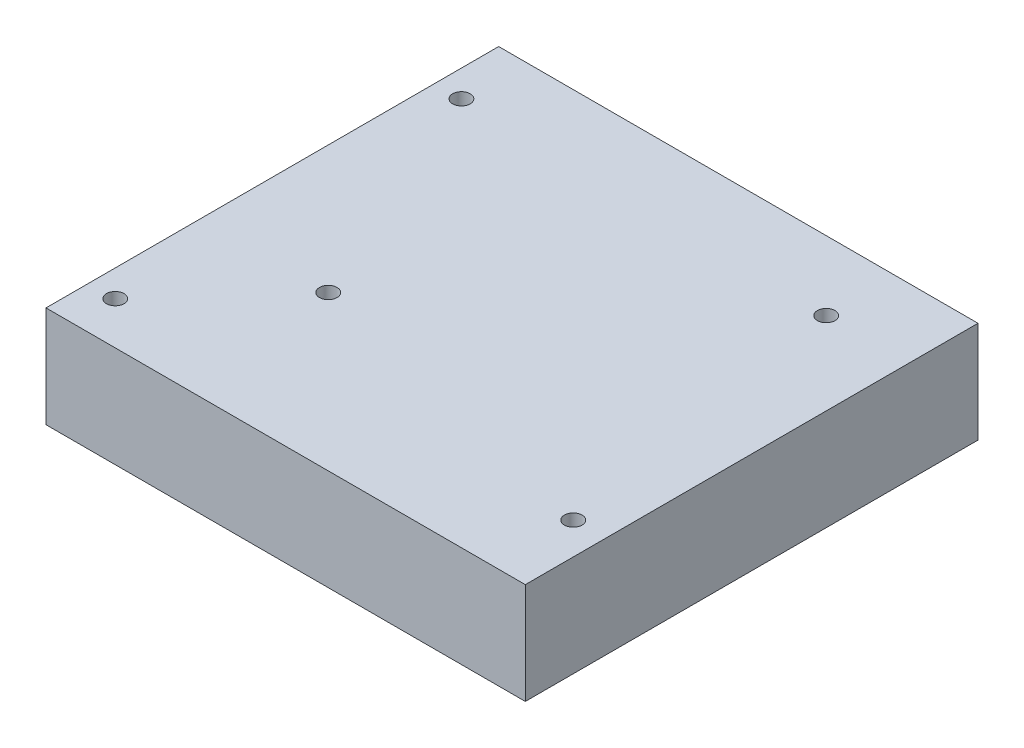
ISO-10303-21;
HEADER;
FILE_DESCRIPTION(('STEP AP214'),'2;1');
FILE_NAME('part.step','',(''),(''),'','','');
FILE_SCHEMA(('AUTOMOTIVE_DESIGN { 1 0 10303 214 1 1 1 1 }'));
ENDSEC;
DATA;
#1=APPLICATION_CONTEXT('core data for automotive mechanical design processes');
#2=APPLICATION_PROTOCOL_DEFINITION('international standard','automotive_design',2000,#1);
#3=PRODUCT_CONTEXT('',#1,'mechanical');
#4=PRODUCT('Part','Part','',(#3));
#5=PRODUCT_RELATED_PRODUCT_CATEGORY('part','',(#4));
#6=PRODUCT_DEFINITION_FORMATION('','',#4);
#7=PRODUCT_DEFINITION_CONTEXT('part definition',#1,'design');
#8=PRODUCT_DEFINITION('design','',#6,#7);
#9=PRODUCT_DEFINITION_SHAPE('','',#8);
#10=(LENGTH_UNIT() NAMED_UNIT(*) SI_UNIT(.MILLI.,.METRE.));
#11=(NAMED_UNIT(*) PLANE_ANGLE_UNIT() SI_UNIT($,.RADIAN.));
#12=(NAMED_UNIT(*) SI_UNIT($,.STERADIAN.) SOLID_ANGLE_UNIT());
#13=UNCERTAINTY_MEASURE_WITH_UNIT(LENGTH_MEASURE(1.E-05),#10,'distance_accuracy_value','');
#14=(GEOMETRIC_REPRESENTATION_CONTEXT(3) GLOBAL_UNCERTAINTY_ASSIGNED_CONTEXT((#13)) GLOBAL_UNIT_ASSIGNED_CONTEXT((#10,
#11,#12)) REPRESENTATION_CONTEXT('',''));
#15=CARTESIAN_POINT('',(0.,0.,0.));
#16=DIRECTION('',(0.,0.,1.));
#17=DIRECTION('',(1.,0.,0.));
#18=AXIS2_PLACEMENT_3D('',#15,#16,#17);
#19=CARTESIAN_POINT('',(0.,19.,0.));
#20=DIRECTION('',(0.,-1.,0.));
#21=DIRECTION('',(0.,0.,-1.));
#22=AXIS2_PLACEMENT_3D('',#19,#20,#21);
#23=PLANE('',#22);
#24=CARTESIAN_POINT('',(24.,19.,-29.));
#25=DIRECTION('',(0.,1.,0.));
#26=DIRECTION('',(0.,0.,1.));
#27=AXIS2_PLACEMENT_3D('',#24,#25,#26);
#28=CIRCLE('',#27,1.65);
#29=CARTESIAN_POINT('',(24.,19.,-27.35));
#30=VERTEX_POINT('',#29);
#31=EDGE_CURVE('E128',#30,#30,#28,.T.);
#32=ORIENTED_EDGE('',*,*,#31,.F.);
#33=EDGE_LOOP('',(#32));
#34=FACE_BOUND('',#33,.T.);
#35=CARTESIAN_POINT('',(5.,19.,-8.));
#36=DIRECTION('',(0.,1.,0.));
#37=DIRECTION('',(0.,0.,1.));
#38=AXIS2_PLACEMENT_3D('',#35,#36,#37);
#39=CIRCLE('',#38,1.65);
#40=CARTESIAN_POINT('',(5.,19.,-6.35));
#41=VERTEX_POINT('',#40);
#42=EDGE_CURVE('E116',#41,#41,#39,.T.);
#43=ORIENTED_EDGE('',*,*,#42,.F.);
#44=EDGE_LOOP('',(#43));
#45=FACE_BOUND('',#44,.T.);
#46=DIRECTION('',(0.,0.,1.));
#47=VECTOR('',#46,1.);
#48=CARTESIAN_POINT('',(0.,19.,0.));
#49=LINE('',#48,#47);
#50=CARTESIAN_POINT('',(0.,19.,-85.));
#51=VERTEX_POINT('',#50);
#52=CARTESIAN_POINT('',(0.,19.,0.));
#53=VERTEX_POINT('',#52);
#54=EDGE_CURVE('E86',#51,#53,#49,.T.);
#55=ORIENTED_EDGE('',*,*,#54,.T.);
#56=DIRECTION('',(1.,0.,0.));
#57=VECTOR('',#56,1.);
#58=CARTESIAN_POINT('',(0.,19.,0.));
#59=LINE('',#58,#57);
#60=CARTESIAN_POINT('',(90.,19.,0.));
#61=VERTEX_POINT('',#60);
#62=EDGE_CURVE('E81',#53,#61,#59,.T.);
#63=ORIENTED_EDGE('',*,*,#62,.T.);
#64=DIRECTION('',(0.,0.,-1.));
#65=VECTOR('',#64,1.);
#66=CARTESIAN_POINT('',(90.,19.,0.));
#67=LINE('',#66,#65);
#68=CARTESIAN_POINT('',(90.,19.,-85.));
#69=VERTEX_POINT('',#68);
#70=EDGE_CURVE('E84',#61,#69,#67,.T.);
#71=ORIENTED_EDGE('',*,*,#70,.T.);
#72=DIRECTION('',(-1.,0.,0.));
#73=VECTOR('',#72,1.);
#74=CARTESIAN_POINT('',(0.,19.,-85.));
#75=LINE('',#74,#73);
#76=EDGE_CURVE('E51',#69,#51,#75,.T.);
#77=ORIENTED_EDGE('',*,*,#76,.T.);
#78=EDGE_LOOP('',(#55,#63,#71,#77));
#79=FACE_BOUND('',#78,.T.);
#80=CARTESIAN_POINT('',(5.,19.,-73.));
#81=DIRECTION('',(0.,1.,0.));
#82=DIRECTION('',(0.,0.,1.));
#83=AXIS2_PLACEMENT_3D('',#80,#81,#82);
#84=CIRCLE('',#83,1.65);
#85=CARTESIAN_POINT('',(5.,19.,-71.35));
#86=VERTEX_POINT('',#85);
#87=EDGE_CURVE('E101',#86,#86,#84,.T.);
#88=ORIENTED_EDGE('',*,*,#87,.F.);
#89=EDGE_LOOP('',(#88));
#90=FACE_BOUND('',#89,.T.);
#91=CARTESIAN_POINT('',(84.,19.,-15.));
#92=DIRECTION('',(0.,1.,0.));
#93=DIRECTION('',(0.,0.,1.));
#94=AXIS2_PLACEMENT_3D('',#91,#92,#93);
#95=CIRCLE('',#94,1.65);
#96=CARTESIAN_POINT('',(84.,19.,-13.35));
#97=VERTEX_POINT('',#96);
#98=EDGE_CURVE('E122',#97,#97,#95,.T.);
#99=ORIENTED_EDGE('',*,*,#98,.F.);
#100=EDGE_LOOP('',(#99));
#101=FACE_BOUND('',#100,.T.);
#102=CARTESIAN_POINT('',(74.5,19.,-72.));
#103=DIRECTION('',(0.,1.,0.));
#104=DIRECTION('',(0.,0.,1.));
#105=AXIS2_PLACEMENT_3D('',#102,#103,#104);
#106=CIRCLE('',#105,1.65);
#107=CARTESIAN_POINT('',(74.5,19.,-70.35));
#108=VERTEX_POINT('',#107);
#109=EDGE_CURVE('E134',#108,#108,#106,.T.);
#110=ORIENTED_EDGE('',*,*,#109,.F.);
#111=EDGE_LOOP('',(#110));
#112=FACE_BOUND('',#111,.T.);
#113=ADVANCED_FACE('F34',(#34,#45,#79,#90,#101,#112),#23,.F.);
#114=CARTESIAN_POINT('',(0.,0.,0.));
#115=DIRECTION('',(0.,-1.,0.));
#116=DIRECTION('',(0.,0.,-1.));
#117=AXIS2_PLACEMENT_3D('',#114,#115,#116);
#118=PLANE('',#117);
#119=CARTESIAN_POINT('',(24.,0.,-29.));
#120=DIRECTION('',(0.,1.,0.));
#121=DIRECTION('',(0.,0.,1.));
#122=AXIS2_PLACEMENT_3D('',#119,#120,#121);
#123=CIRCLE('',#122,1.65);
#124=CARTESIAN_POINT('',(24.,0.,-27.35));
#125=VERTEX_POINT('',#124);
#126=EDGE_CURVE('E131',#125,#125,#123,.T.);
#127=ORIENTED_EDGE('',*,*,#126,.T.);
#128=EDGE_LOOP('',(#127));
#129=FACE_BOUND('',#128,.T.);
#130=CARTESIAN_POINT('',(5.,0.,-8.));
#131=DIRECTION('',(0.,1.,0.));
#132=DIRECTION('',(0.,0.,1.));
#133=AXIS2_PLACEMENT_3D('',#130,#131,#132);
#134=CIRCLE('',#133,1.65);
#135=CARTESIAN_POINT('',(5.,0.,-6.35));
#136=VERTEX_POINT('',#135);
#137=EDGE_CURVE('E119',#136,#136,#134,.T.);
#138=ORIENTED_EDGE('',*,*,#137,.T.);
#139=EDGE_LOOP('',(#138));
#140=FACE_BOUND('',#139,.T.);
#141=DIRECTION('',(0.,0.,1.));
#142=VECTOR('',#141,1.);
#143=CARTESIAN_POINT('',(0.,0.,0.));
#144=LINE('',#143,#142);
#145=CARTESIAN_POINT('',(0.,0.,-85.));
#146=VERTEX_POINT('',#145);
#147=CARTESIAN_POINT('',(0.,0.,0.));
#148=VERTEX_POINT('',#147);
#149=EDGE_CURVE('E98',#146,#148,#144,.T.);
#150=ORIENTED_EDGE('',*,*,#149,.F.);
#151=DIRECTION('',(-1.,0.,0.));
#152=VECTOR('',#151,1.);
#153=CARTESIAN_POINT('',(0.,0.,-85.));
#154=LINE('',#153,#152);
#155=CARTESIAN_POINT('',(90.,0.,-85.));
#156=VERTEX_POINT('',#155);
#157=EDGE_CURVE('E74',#156,#146,#154,.T.);
#158=ORIENTED_EDGE('',*,*,#157,.F.);
#159=DIRECTION('',(0.,0.,-1.));
#160=VECTOR('',#159,1.);
#161=CARTESIAN_POINT('',(90.,0.,0.));
#162=LINE('',#161,#160);
#163=CARTESIAN_POINT('',(90.,0.,0.));
#164=VERTEX_POINT('',#163);
#165=EDGE_CURVE('E68',#164,#156,#162,.T.);
#166=ORIENTED_EDGE('',*,*,#165,.F.);
#167=DIRECTION('',(1.,0.,0.));
#168=VECTOR('',#167,1.);
#169=CARTESIAN_POINT('',(0.,0.,0.));
#170=LINE('',#169,#168);
#171=EDGE_CURVE('E90',#148,#164,#170,.T.);
#172=ORIENTED_EDGE('',*,*,#171,.F.);
#173=EDGE_LOOP('',(#150,#158,#166,#172));
#174=FACE_BOUND('',#173,.T.);
#175=CARTESIAN_POINT('',(5.,0.,-73.));
#176=DIRECTION('',(0.,1.,0.));
#177=DIRECTION('',(0.,0.,1.));
#178=AXIS2_PLACEMENT_3D('',#175,#176,#177);
#179=CIRCLE('',#178,1.65);
#180=CARTESIAN_POINT('',(5.,0.,-71.35));
#181=VERTEX_POINT('',#180);
#182=EDGE_CURVE('E113',#181,#181,#179,.T.);
#183=ORIENTED_EDGE('',*,*,#182,.T.);
#184=EDGE_LOOP('',(#183));
#185=FACE_BOUND('',#184,.T.);
#186=CARTESIAN_POINT('',(84.,0.,-15.));
#187=DIRECTION('',(0.,1.,0.));
#188=DIRECTION('',(0.,0.,1.));
#189=AXIS2_PLACEMENT_3D('',#186,#187,#188);
#190=CIRCLE('',#189,1.65);
#191=CARTESIAN_POINT('',(84.,0.,-13.35));
#192=VERTEX_POINT('',#191);
#193=EDGE_CURVE('E125',#192,#192,#190,.T.);
#194=ORIENTED_EDGE('',*,*,#193,.T.);
#195=EDGE_LOOP('',(#194));
#196=FACE_BOUND('',#195,.T.);
#197=CARTESIAN_POINT('',(74.5,0.,-72.));
#198=DIRECTION('',(0.,1.,0.));
#199=DIRECTION('',(0.,0.,1.));
#200=AXIS2_PLACEMENT_3D('',#197,#198,#199);
#201=CIRCLE('',#200,1.65);
#202=CARTESIAN_POINT('',(74.5,0.,-70.35));
#203=VERTEX_POINT('',#202);
#204=EDGE_CURVE('E137',#203,#203,#201,.T.);
#205=ORIENTED_EDGE('',*,*,#204,.T.);
#206=EDGE_LOOP('',(#205));
#207=FACE_BOUND('',#206,.T.);
#208=ADVANCED_FACE('F109',(#129,#140,#174,#185,#196,#207),#118,.T.);
#209=CARTESIAN_POINT('',(0.,19.,0.));
#210=DIRECTION('',(1.,0.,0.));
#211=DIRECTION('',(0.,0.,-1.));
#212=AXIS2_PLACEMENT_3D('',#209,#210,#211);
#213=PLANE('',#212);
#214=ORIENTED_EDGE('',*,*,#149,.T.);
#215=DIRECTION('',(0.,-1.,0.));
#216=VECTOR('',#215,1.);
#217=CARTESIAN_POINT('',(0.,19.,0.));
#218=LINE('',#217,#216);
#219=EDGE_CURVE('E11',#53,#148,#218,.T.);
#220=ORIENTED_EDGE('',*,*,#219,.F.);
#221=ORIENTED_EDGE('',*,*,#54,.F.);
#222=DIRECTION('',(0.,-1.,0.));
#223=VECTOR('',#222,1.);
#224=CARTESIAN_POINT('',(0.,19.,-85.));
#225=LINE('',#224,#223);
#226=EDGE_CURVE('E94',#51,#146,#225,.T.);
#227=ORIENTED_EDGE('',*,*,#226,.T.);
#228=EDGE_LOOP('',(#214,#220,#221,#227));
#229=FACE_BOUND('',#228,.T.);
#230=ADVANCED_FACE('F36',(#229),#213,.F.);
#231=CARTESIAN_POINT('',(0.,19.,0.));
#232=DIRECTION('',(0.,0.,-1.));
#233=DIRECTION('',(-1.,0.,0.));
#234=AXIS2_PLACEMENT_3D('',#231,#232,#233);
#235=PLANE('',#234);
#236=ORIENTED_EDGE('',*,*,#171,.T.);
#237=DIRECTION('',(0.,-1.,0.));
#238=VECTOR('',#237,1.);
#239=CARTESIAN_POINT('',(90.,19.,0.));
#240=LINE('',#239,#238);
#241=EDGE_CURVE('E43',#61,#164,#240,.T.);
#242=ORIENTED_EDGE('',*,*,#241,.F.);
#243=ORIENTED_EDGE('',*,*,#62,.F.);
#244=ORIENTED_EDGE('',*,*,#219,.T.);
#245=EDGE_LOOP('',(#236,#242,#243,#244));
#246=FACE_BOUND('',#245,.T.);
#247=ADVANCED_FACE('F89',(#246),#235,.F.);
#248=CARTESIAN_POINT('',(90.,19.,0.));
#249=DIRECTION('',(-1.,0.,0.));
#250=DIRECTION('',(0.,0.,1.));
#251=AXIS2_PLACEMENT_3D('',#248,#249,#250);
#252=PLANE('',#251);
#253=ORIENTED_EDGE('',*,*,#165,.T.);
#254=DIRECTION('',(0.,-1.,0.));
#255=VECTOR('',#254,1.);
#256=CARTESIAN_POINT('',(90.,19.,-85.));
#257=LINE('',#256,#255);
#258=EDGE_CURVE('E91',#69,#156,#257,.T.);
#259=ORIENTED_EDGE('',*,*,#258,.F.);
#260=ORIENTED_EDGE('',*,*,#70,.F.);
#261=ORIENTED_EDGE('',*,*,#241,.T.);
#262=EDGE_LOOP('',(#253,#259,#260,#261));
#263=FACE_BOUND('',#262,.T.);
#264=ADVANCED_FACE('F92',(#263),#252,.F.);
#265=CARTESIAN_POINT('',(0.,19.,-85.));
#266=DIRECTION('',(0.,0.,1.));
#267=DIRECTION('',(1.,0.,0.));
#268=AXIS2_PLACEMENT_3D('',#265,#266,#267);
#269=PLANE('',#268);
#270=ORIENTED_EDGE('',*,*,#157,.T.);
#271=ORIENTED_EDGE('',*,*,#226,.F.);
#272=ORIENTED_EDGE('',*,*,#76,.F.);
#273=ORIENTED_EDGE('',*,*,#258,.T.);
#274=EDGE_LOOP('',(#270,#271,#272,#273));
#275=FACE_BOUND('',#274,.T.);
#276=ADVANCED_FACE('F106',(#275),#269,.F.);
#277=CARTESIAN_POINT('',(5.,19.,-73.));
#278=DIRECTION('',(0.,-1.,0.));
#279=DIRECTION('',(0.,0.,-1.));
#280=AXIS2_PLACEMENT_3D('',#277,#278,#279);
#281=CYLINDRICAL_SURFACE('',#280,1.65);
#282=ORIENTED_EDGE('',*,*,#87,.T.);
#283=EDGE_LOOP('',(#282));
#284=FACE_BOUND('',#283,.T.);
#285=ORIENTED_EDGE('',*,*,#182,.F.);
#286=EDGE_LOOP('',(#285));
#287=FACE_BOUND('',#286,.T.);
#288=ADVANCED_FACE('F157',(#284,#287),#281,.F.);
#289=CARTESIAN_POINT('',(5.,19.,-8.));
#290=DIRECTION('',(0.,-1.,0.));
#291=DIRECTION('',(0.,0.,-1.));
#292=AXIS2_PLACEMENT_3D('',#289,#290,#291);
#293=CYLINDRICAL_SURFACE('',#292,1.65);
#294=ORIENTED_EDGE('',*,*,#42,.T.);
#295=EDGE_LOOP('',(#294));
#296=FACE_BOUND('',#295,.T.);
#297=ORIENTED_EDGE('',*,*,#137,.F.);
#298=EDGE_LOOP('',(#297));
#299=FACE_BOUND('',#298,.T.);
#300=ADVANCED_FACE('F195',(#296,#299),#293,.F.);
#301=CARTESIAN_POINT('',(84.,19.,-15.));
#302=DIRECTION('',(0.,-1.,0.));
#303=DIRECTION('',(0.,0.,-1.));
#304=AXIS2_PLACEMENT_3D('',#301,#302,#303);
#305=CYLINDRICAL_SURFACE('',#304,1.65);
#306=ORIENTED_EDGE('',*,*,#98,.T.);
#307=EDGE_LOOP('',(#306));
#308=FACE_BOUND('',#307,.T.);
#309=ORIENTED_EDGE('',*,*,#193,.F.);
#310=EDGE_LOOP('',(#309));
#311=FACE_BOUND('',#310,.T.);
#312=ADVANCED_FACE('F202',(#308,#311),#305,.F.);
#313=CARTESIAN_POINT('',(24.,19.,-29.));
#314=DIRECTION('',(0.,-1.,0.));
#315=DIRECTION('',(0.,0.,-1.));
#316=AXIS2_PLACEMENT_3D('',#313,#314,#315);
#317=CYLINDRICAL_SURFACE('',#316,1.65);
#318=ORIENTED_EDGE('',*,*,#31,.T.);
#319=EDGE_LOOP('',(#318));
#320=FACE_BOUND('',#319,.T.);
#321=ORIENTED_EDGE('',*,*,#126,.F.);
#322=EDGE_LOOP('',(#321));
#323=FACE_BOUND('',#322,.T.);
#324=ADVANCED_FACE('F209',(#320,#323),#317,.F.);
#325=CARTESIAN_POINT('',(74.5,19.,-72.));
#326=DIRECTION('',(0.,-1.,0.));
#327=DIRECTION('',(0.,0.,-1.));
#328=AXIS2_PLACEMENT_3D('',#325,#326,#327);
#329=CYLINDRICAL_SURFACE('',#328,1.65);
#330=ORIENTED_EDGE('',*,*,#109,.T.);
#331=EDGE_LOOP('',(#330));
#332=FACE_BOUND('',#331,.T.);
#333=ORIENTED_EDGE('',*,*,#204,.F.);
#334=EDGE_LOOP('',(#333));
#335=FACE_BOUND('',#334,.T.);
#336=ADVANCED_FACE('F143',(#332,#335),#329,.F.);
#337=CLOSED_SHELL('',(#113,#208,#230,#247,#264,#276,#288,#300,#312,#324,#336));
#338=MANIFOLD_SOLID_BREP('B2',#337);
#339=ADVANCED_BREP_SHAPE_REPRESENTATION('',(#18,#338),#14);
#340=SHAPE_DEFINITION_REPRESENTATION(#9,#339);
ENDSEC;
END-ISO-10303-21;
